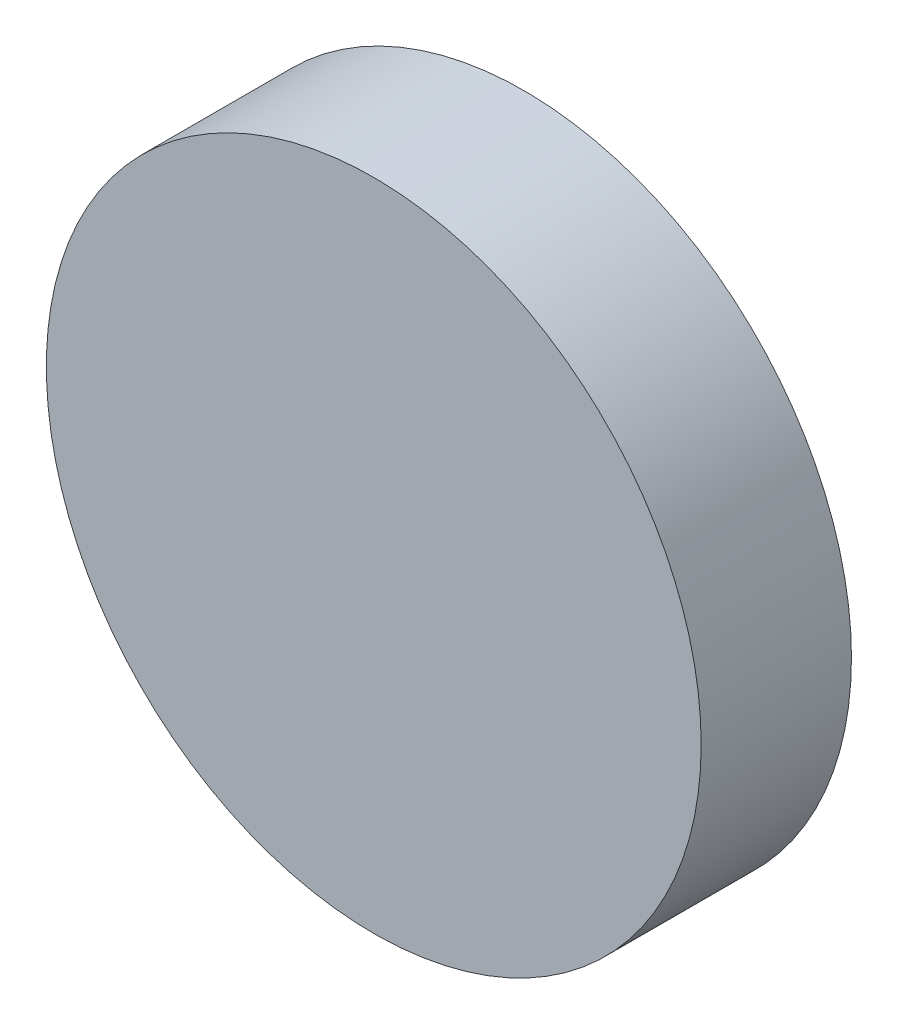
ISO-10303-21;
HEADER;
FILE_DESCRIPTION(('STEP AP214'),'2;1');
FILE_NAME('part.step','',(''),(''),'','','');
FILE_SCHEMA(('AUTOMOTIVE_DESIGN { 1 0 10303 214 1 1 1 1 }'));
ENDSEC;
DATA;
#1=APPLICATION_CONTEXT('core data for automotive mechanical design processes');
#2=APPLICATION_PROTOCOL_DEFINITION('international standard','automotive_design',2000,#1);
#3=PRODUCT_CONTEXT('',#1,'mechanical');
#4=PRODUCT('Part','Part','',(#3));
#5=PRODUCT_RELATED_PRODUCT_CATEGORY('part','',(#4));
#6=PRODUCT_DEFINITION_FORMATION('','',#4);
#7=PRODUCT_DEFINITION_CONTEXT('part definition',#1,'design');
#8=PRODUCT_DEFINITION('design','',#6,#7);
#9=PRODUCT_DEFINITION_SHAPE('','',#8);
#10=(LENGTH_UNIT() NAMED_UNIT(*) SI_UNIT(.MILLI.,.METRE.));
#11=(NAMED_UNIT(*) PLANE_ANGLE_UNIT() SI_UNIT($,.RADIAN.));
#12=(NAMED_UNIT(*) SI_UNIT($,.STERADIAN.) SOLID_ANGLE_UNIT());
#13=UNCERTAINTY_MEASURE_WITH_UNIT(LENGTH_MEASURE(1.E-05),#10,'distance_accuracy_value','');
#14=(GEOMETRIC_REPRESENTATION_CONTEXT(3) GLOBAL_UNCERTAINTY_ASSIGNED_CONTEXT((#13)) GLOBAL_UNIT_ASSIGNED_CONTEXT((#10,
#11,#12)) REPRESENTATION_CONTEXT('',''));
#15=CARTESIAN_POINT('',(0.,0.,0.));
#16=DIRECTION('',(0.,0.,1.));
#17=DIRECTION('',(1.,0.,0.));
#18=AXIS2_PLACEMENT_3D('',#15,#16,#17);
#19=CARTESIAN_POINT('',(0.,0.,7.));
#20=DIRECTION('',(0.,0.,-1.));
#21=DIRECTION('',(-1.,0.,0.));
#22=AXIS2_PLACEMENT_3D('',#19,#20,#21);
#23=CYLINDRICAL_SURFACE('',#22,15.25);
#24=CARTESIAN_POINT('',(0.,0.,7.));
#25=DIRECTION('',(0.,0.,1.));
#26=DIRECTION('',(1.,0.,0.));
#27=AXIS2_PLACEMENT_3D('',#24,#25,#26);
#28=CIRCLE('',#27,15.25);
#29=CARTESIAN_POINT('',(15.25,0.,7.));
#30=VERTEX_POINT('',#29);
#31=EDGE_CURVE('E10',#30,#30,#28,.T.);
#32=ORIENTED_EDGE('',*,*,#31,.F.);
#33=EDGE_LOOP('',(#32));
#34=FACE_BOUND('',#33,.T.);
#35=CARTESIAN_POINT('',(0.,0.,0.));
#36=DIRECTION('',(0.,0.,1.));
#37=DIRECTION('',(1.,0.,0.));
#38=AXIS2_PLACEMENT_3D('',#35,#36,#37);
#39=CIRCLE('',#38,15.25);
#40=CARTESIAN_POINT('',(15.25,0.,0.));
#41=VERTEX_POINT('',#40);
#42=EDGE_CURVE('E39',#41,#41,#39,.T.);
#43=ORIENTED_EDGE('',*,*,#42,.T.);
#44=EDGE_LOOP('',(#43));
#45=FACE_BOUND('',#44,.T.);
#46=ADVANCED_FACE('F36',(#34,#45),#23,.T.);
#47=CARTESIAN_POINT('',(0.,0.,7.));
#48=DIRECTION('',(0.,0.,1.));
#49=DIRECTION('',(1.,0.,0.));
#50=AXIS2_PLACEMENT_3D('',#47,#48,#49);
#51=PLANE('',#50);
#52=ORIENTED_EDGE('',*,*,#31,.T.);
#53=EDGE_LOOP('',(#52));
#54=FACE_BOUND('',#53,.T.);
#55=ADVANCED_FACE('F51',(#54),#51,.T.);
#56=CARTESIAN_POINT('',(0.,0.,0.));
#57=DIRECTION('',(0.,0.,1.));
#58=DIRECTION('',(1.,0.,0.));
#59=AXIS2_PLACEMENT_3D('',#56,#57,#58);
#60=PLANE('',#59);
#61=ORIENTED_EDGE('',*,*,#42,.F.);
#62=EDGE_LOOP('',(#61));
#63=FACE_BOUND('',#62,.T.);
#64=ADVANCED_FACE('F49',(#63),#60,.F.);
#65=CLOSED_SHELL('',(#46,#55,#64));
#66=MANIFOLD_SOLID_BREP('B2',#65);
#67=ADVANCED_BREP_SHAPE_REPRESENTATION('',(#18,#66),#14);
#68=SHAPE_DEFINITION_REPRESENTATION(#9,#67);
ENDSEC;
END-ISO-10303-21;
